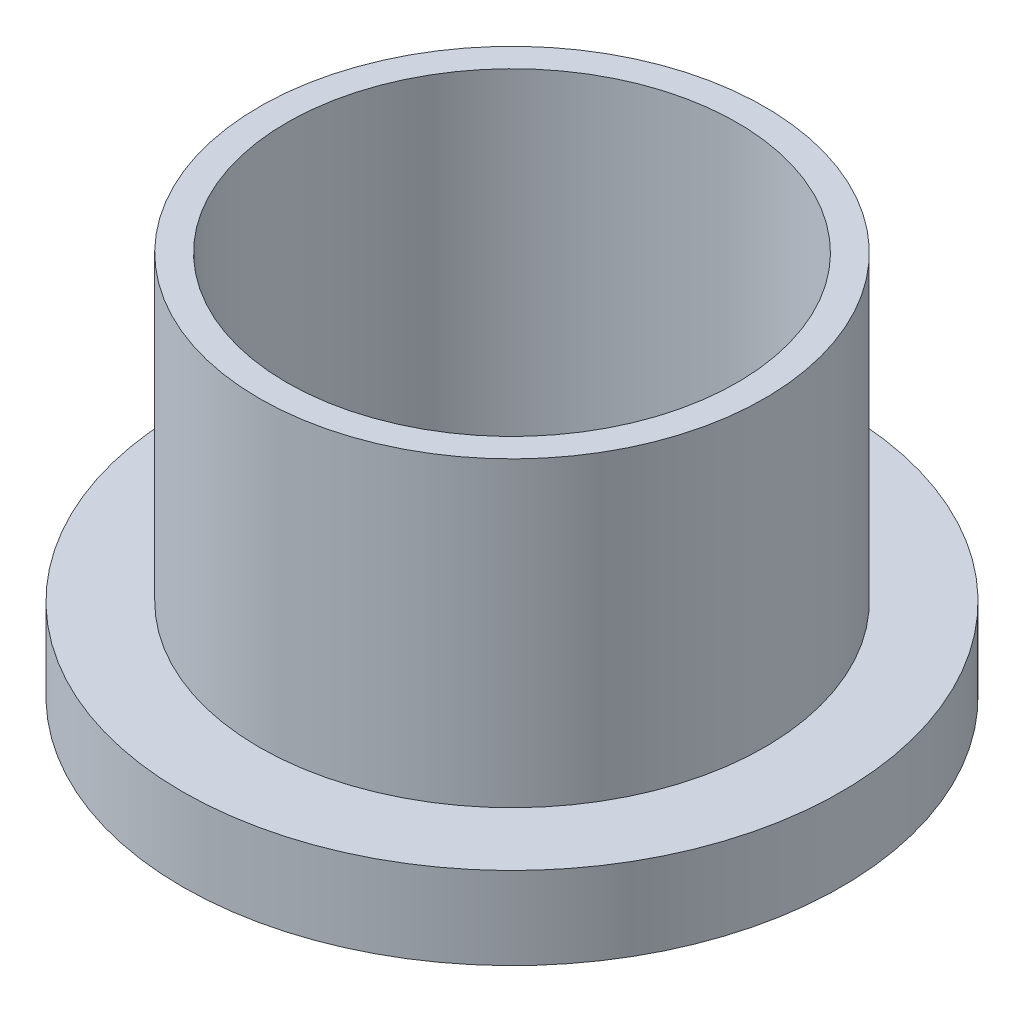
ISO-10303-21;
HEADER;
FILE_DESCRIPTION(('STEP AP214'),'2;1');
FILE_NAME('part.step','',(''),(''),'','','');
FILE_SCHEMA(('AUTOMOTIVE_DESIGN { 1 0 10303 214 1 1 1 1 }'));
ENDSEC;
DATA;
#1=APPLICATION_CONTEXT('core data for automotive mechanical design processes');
#2=APPLICATION_PROTOCOL_DEFINITION('international standard','automotive_design',2000,#1);
#3=PRODUCT_CONTEXT('',#1,'mechanical');
#4=PRODUCT('Part','Part','',(#3));
#5=PRODUCT_RELATED_PRODUCT_CATEGORY('part','',(#4));
#6=PRODUCT_DEFINITION_FORMATION('','',#4);
#7=PRODUCT_DEFINITION_CONTEXT('part definition',#1,'design');
#8=PRODUCT_DEFINITION('design','',#6,#7);
#9=PRODUCT_DEFINITION_SHAPE('','',#8);
#10=(LENGTH_UNIT() NAMED_UNIT(*) SI_UNIT(.MILLI.,.METRE.));
#11=(NAMED_UNIT(*) PLANE_ANGLE_UNIT() SI_UNIT($,.RADIAN.));
#12=(NAMED_UNIT(*) SI_UNIT($,.STERADIAN.) SOLID_ANGLE_UNIT());
#13=UNCERTAINTY_MEASURE_WITH_UNIT(LENGTH_MEASURE(1.E-05),#10,'distance_accuracy_value','');
#14=(GEOMETRIC_REPRESENTATION_CONTEXT(3) GLOBAL_UNCERTAINTY_ASSIGNED_CONTEXT((#13)) GLOBAL_UNIT_ASSIGNED_CONTEXT((#10,
#11,#12)) REPRESENTATION_CONTEXT('',''));
#15=CARTESIAN_POINT('',(0.,0.,0.));
#16=DIRECTION('',(0.,0.,1.));
#17=DIRECTION('',(1.,0.,0.));
#18=AXIS2_PLACEMENT_3D('',#15,#16,#17);
#19=CARTESIAN_POINT('',(0.,7.,0.));
#20=DIRECTION('',(0.,1.,0.));
#21=DIRECTION('',(0.,0.,1.));
#22=AXIS2_PLACEMENT_3D('',#19,#20,#21);
#23=PLANE('',#22);
#24=CARTESIAN_POINT('',(0.,7.,0.));
#25=DIRECTION('',(0.,1.,0.));
#26=DIRECTION('',(0.,0.,1.));
#27=AXIS2_PLACEMENT_3D('',#24,#25,#26);
#28=CIRCLE('',#27,4.6);
#29=CARTESIAN_POINT('',(0.,7.,4.6));
#30=VERTEX_POINT('',#29);
#31=EDGE_CURVE('E10',#30,#30,#28,.T.);
#32=ORIENTED_EDGE('',*,*,#31,.T.);
#33=EDGE_LOOP('',(#32));
#34=FACE_BOUND('',#33,.T.);
#35=CARTESIAN_POINT('',(0.,7.,0.));
#36=DIRECTION('',(0.,1.,0.));
#37=DIRECTION('',(0.,0.,1.));
#38=AXIS2_PLACEMENT_3D('',#35,#36,#37);
#39=CIRCLE('',#38,4.1);
#40=CARTESIAN_POINT('',(0.,7.,4.1));
#41=VERTEX_POINT('',#40);
#42=EDGE_CURVE('E43',#41,#41,#39,.T.);
#43=ORIENTED_EDGE('',*,*,#42,.F.);
#44=EDGE_LOOP('',(#43));
#45=FACE_BOUND('',#44,.T.);
#46=ADVANCED_FACE('F35',(#34,#45),#23,.T.);
#47=CARTESIAN_POINT('',(0.,0.,0.));
#48=DIRECTION('',(0.,1.,0.));
#49=DIRECTION('',(0.,0.,1.));
#50=AXIS2_PLACEMENT_3D('',#47,#48,#49);
#51=PLANE('',#50);
#52=CARTESIAN_POINT('',(0.,0.,0.));
#53=DIRECTION('',(0.,1.,0.));
#54=DIRECTION('',(0.,0.,1.));
#55=AXIS2_PLACEMENT_3D('',#52,#53,#54);
#56=CIRCLE('',#55,4.1);
#57=CARTESIAN_POINT('',(0.,0.,4.1));
#58=VERTEX_POINT('',#57);
#59=EDGE_CURVE('E48',#58,#58,#56,.T.);
#60=ORIENTED_EDGE('',*,*,#59,.T.);
#61=EDGE_LOOP('',(#60));
#62=FACE_BOUND('',#61,.T.);
#63=CARTESIAN_POINT('',(0.,0.,0.));
#64=DIRECTION('',(0.,1.,0.));
#65=DIRECTION('',(0.,0.,1.));
#66=AXIS2_PLACEMENT_3D('',#63,#64,#65);
#67=CIRCLE('',#66,6.);
#68=CARTESIAN_POINT('',(0.,0.,6.));
#69=VERTEX_POINT('',#68);
#70=EDGE_CURVE('E55',#69,#69,#67,.T.);
#71=ORIENTED_EDGE('',*,*,#70,.F.);
#72=EDGE_LOOP('',(#71));
#73=FACE_BOUND('',#72,.T.);
#74=ADVANCED_FACE('F80',(#62,#73),#51,.F.);
#75=CARTESIAN_POINT('',(0.,7.,0.));
#76=DIRECTION('',(0.,-1.,0.));
#77=DIRECTION('',(0.,0.,-1.));
#78=AXIS2_PLACEMENT_3D('',#75,#76,#77);
#79=CYLINDRICAL_SURFACE('',#78,4.6);
#80=CARTESIAN_POINT('',(0.,1.5,0.));
#81=DIRECTION('',(0.,1.,0.));
#82=DIRECTION('',(0.,0.,1.));
#83=AXIS2_PLACEMENT_3D('',#80,#81,#82);
#84=CIRCLE('',#83,4.6);
#85=CARTESIAN_POINT('',(0.,1.5,4.6));
#86=VERTEX_POINT('',#85);
#87=EDGE_CURVE('E58',#86,#86,#84,.T.);
#88=ORIENTED_EDGE('',*,*,#87,.T.);
#89=EDGE_LOOP('',(#88));
#90=FACE_BOUND('',#89,.T.);
#91=ORIENTED_EDGE('',*,*,#31,.F.);
#92=EDGE_LOOP('',(#91));
#93=FACE_BOUND('',#92,.T.);
#94=ADVANCED_FACE('F37',(#90,#93),#79,.T.);
#95=CARTESIAN_POINT('',(0.,7.,0.));
#96=DIRECTION('',(0.,-1.,0.));
#97=DIRECTION('',(0.,0.,-1.));
#98=AXIS2_PLACEMENT_3D('',#95,#96,#97);
#99=CYLINDRICAL_SURFACE('',#98,4.1);
#100=ORIENTED_EDGE('',*,*,#42,.T.);
#101=EDGE_LOOP('',(#100));
#102=FACE_BOUND('',#101,.T.);
#103=ORIENTED_EDGE('',*,*,#59,.F.);
#104=EDGE_LOOP('',(#103));
#105=FACE_BOUND('',#104,.T.);
#106=ADVANCED_FACE('F69',(#102,#105),#99,.F.);
#107=CARTESIAN_POINT('',(0.,1.5,0.));
#108=DIRECTION('',(0.,1.,0.));
#109=DIRECTION('',(0.,0.,1.));
#110=AXIS2_PLACEMENT_3D('',#107,#108,#109);
#111=PLANE('',#110);
#112=CARTESIAN_POINT('',(0.,1.5,0.));
#113=DIRECTION('',(0.,1.,0.));
#114=DIRECTION('',(0.,0.,1.));
#115=AXIS2_PLACEMENT_3D('',#112,#113,#114);
#116=CIRCLE('',#115,6.);
#117=CARTESIAN_POINT('',(0.,1.5,6.));
#118=VERTEX_POINT('',#117);
#119=EDGE_CURVE('E53',#118,#118,#116,.T.);
#120=ORIENTED_EDGE('',*,*,#119,.T.);
#121=EDGE_LOOP('',(#120));
#122=FACE_BOUND('',#121,.T.);
#123=ORIENTED_EDGE('',*,*,#87,.F.);
#124=EDGE_LOOP('',(#123));
#125=FACE_BOUND('',#124,.T.);
#126=ADVANCED_FACE('F66',(#122,#125),#111,.T.);
#127=CARTESIAN_POINT('',(0.,1.5,0.));
#128=DIRECTION('',(0.,-1.,0.));
#129=DIRECTION('',(0.,0.,-1.));
#130=AXIS2_PLACEMENT_3D('',#127,#128,#129);
#131=CYLINDRICAL_SURFACE('',#130,6.);
#132=ORIENTED_EDGE('',*,*,#119,.F.);
#133=EDGE_LOOP('',(#132));
#134=FACE_BOUND('',#133,.T.);
#135=ORIENTED_EDGE('',*,*,#70,.T.);
#136=EDGE_LOOP('',(#135));
#137=FACE_BOUND('',#136,.T.);
#138=ADVANCED_FACE('F68',(#134,#137),#131,.T.);
#139=CLOSED_SHELL('',(#46,#74,#94,#106,#126,#138));
#140=MANIFOLD_SOLID_BREP('B2',#139);
#141=ADVANCED_BREP_SHAPE_REPRESENTATION('',(#18,#140),#14);
#142=SHAPE_DEFINITION_REPRESENTATION(#9,#141);
ENDSEC;
END-ISO-10303-21;
